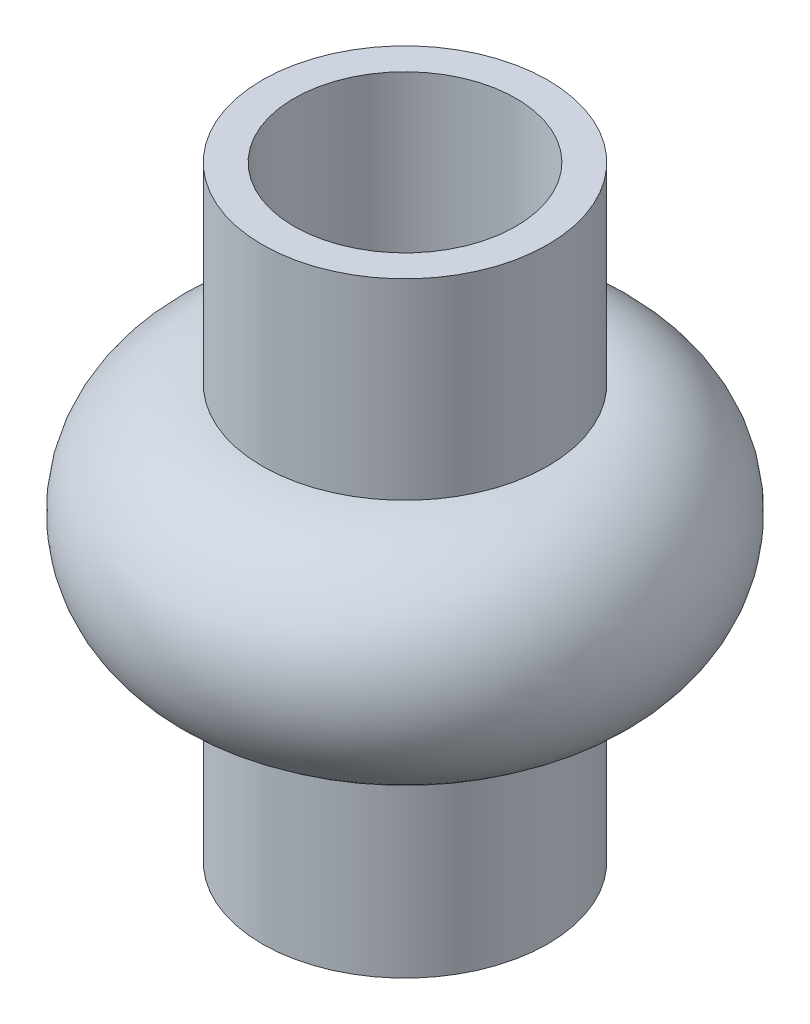
ISO-10303-21;
HEADER;
FILE_DESCRIPTION(('STEP AP214'),'2;1');
FILE_NAME('part.step','',(''),(''),'','','');
FILE_SCHEMA(('AUTOMOTIVE_DESIGN { 1 0 10303 214 1 1 1 1 }'));
ENDSEC;
DATA;
#1=APPLICATION_CONTEXT('core data for automotive mechanical design processes');
#2=APPLICATION_PROTOCOL_DEFINITION('international standard','automotive_design',2000,#1);
#3=PRODUCT_CONTEXT('',#1,'mechanical');
#4=PRODUCT('Part','Part','',(#3));
#5=PRODUCT_RELATED_PRODUCT_CATEGORY('part','',(#4));
#6=PRODUCT_DEFINITION_FORMATION('','',#4);
#7=PRODUCT_DEFINITION_CONTEXT('part definition',#1,'design');
#8=PRODUCT_DEFINITION('design','',#6,#7);
#9=PRODUCT_DEFINITION_SHAPE('','',#8);
#10=(LENGTH_UNIT() NAMED_UNIT(*) SI_UNIT(.MILLI.,.METRE.));
#11=(NAMED_UNIT(*) PLANE_ANGLE_UNIT() SI_UNIT($,.RADIAN.));
#12=(NAMED_UNIT(*) SI_UNIT($,.STERADIAN.) SOLID_ANGLE_UNIT());
#13=UNCERTAINTY_MEASURE_WITH_UNIT(LENGTH_MEASURE(1.E-05),#10,'distance_accuracy_value','');
#14=(GEOMETRIC_REPRESENTATION_CONTEXT(3) GLOBAL_UNCERTAINTY_ASSIGNED_CONTEXT((#13)) GLOBAL_UNIT_ASSIGNED_CONTEXT((#10,
#11,#12)) REPRESENTATION_CONTEXT('',''));
#15=CARTESIAN_POINT('',(0.,0.,0.));
#16=DIRECTION('',(0.,0.,1.));
#17=DIRECTION('',(1.,0.,0.));
#18=AXIS2_PLACEMENT_3D('',#15,#16,#17);
#19=CARTESIAN_POINT('',(-7.,7.,0.));
#20=CARTESIAN_POINT('',(-7.,5.32892910344493,0.));
#21=CARTESIAN_POINT('',(-12.6998049546355,5.9906861598264,0.));
#22=CARTESIAN_POINT('',(-14.713166347637,-0.0225987930732187,0.));
#23=CARTESIAN_POINT('',(-12.6998049546355,-5.90828507939861,0.));
#24=CARTESIAN_POINT('',(-7.,-5.46458272505829,0.));
#25=CARTESIAN_POINT('',(-7.,-7.,0.));
#26=B_SPLINE_CURVE_WITH_KNOTS('',3,(#19,#20,#21,#22,#23,#24,#25),.UNSPECIFIED.,.F.,.F.,(4,1,1,1,
4),(0.,0.225746398519351,0.5,0.774253601480648,1.),.UNSPECIFIED.);
#27=CARTESIAN_POINT('',(0.,18.4626539289852,0.));
#28=DIRECTION('',(0.,1.,0.));
#29=AXIS1_PLACEMENT('',#27,#28);
#30=SURFACE_OF_REVOLUTION('',#26,#29);
#31=CARTESIAN_POINT('',(0.,-7.,0.));
#32=DIRECTION('',(0.,1.,0.));
#33=DIRECTION('',(0.,0.,1.));
#34=AXIS2_PLACEMENT_3D('',#31,#32,#33);
#35=CIRCLE('',#34,7.);
#36=CARTESIAN_POINT('',(0.,-7.,7.));
#37=VERTEX_POINT('',#36);
#38=EDGE_CURVE('E81',#37,#37,#35,.T.);
#39=ORIENTED_EDGE('',*,*,#38,.F.);
#40=EDGE_LOOP('',(#39));
#41=FACE_BOUND('',#40,.T.);
#42=CARTESIAN_POINT('',(0.,7.,0.));
#43=DIRECTION('',(0.,1.,0.));
#44=DIRECTION('',(0.,0.,1.));
#45=AXIS2_PLACEMENT_3D('',#42,#43,#44);
#46=CIRCLE('',#45,7.);
#47=CARTESIAN_POINT('',(0.,7.,7.));
#48=VERTEX_POINT('',#47);
#49=EDGE_CURVE('E10',#48,#48,#46,.T.);
#50=ORIENTED_EDGE('',*,*,#49,.T.);
#51=EDGE_LOOP('',(#50));
#52=FACE_BOUND('',#51,.T.);
#53=ADVANCED_FACE('F45',(#41,#52),#30,.T.);
#54=CARTESIAN_POINT('',(0.,18.4626539289852,0.));
#55=DIRECTION('',(0.,1.,0.));
#56=DIRECTION('',(0.,0.,1.));
#57=AXIS2_PLACEMENT_3D('',#54,#55,#56);
#58=CYLINDRICAL_SURFACE('',#57,7.);
#59=ORIENTED_EDGE('',*,*,#49,.F.);
#60=EDGE_LOOP('',(#59));
#61=FACE_BOUND('',#60,.T.);
#62=CARTESIAN_POINT('',(0.,19.1,0.));
#63=DIRECTION('',(0.,1.,0.));
#64=DIRECTION('',(0.,0.,1.));
#65=AXIS2_PLACEMENT_3D('',#62,#63,#64);
#66=CIRCLE('',#65,7.);
#67=CARTESIAN_POINT('',(0.,19.1,7.));
#68=VERTEX_POINT('',#67);
#69=EDGE_CURVE('E53',#68,#68,#66,.T.);
#70=ORIENTED_EDGE('',*,*,#69,.T.);
#71=EDGE_LOOP('',(#70));
#72=FACE_BOUND('',#71,.T.);
#73=ADVANCED_FACE('F96',(#61,#72),#58,.F.);
#74=CARTESIAN_POINT('',(0.,19.1,0.));
#75=DIRECTION('',(0.,-1.,0.));
#76=DIRECTION('',(0.,0.,-1.));
#77=AXIS2_PLACEMENT_3D('',#74,#75,#76);
#78=PLANE('',#77);
#79=ORIENTED_EDGE('',*,*,#69,.F.);
#80=EDGE_LOOP('',(#79));
#81=FACE_BOUND('',#80,.T.);
#82=CARTESIAN_POINT('',(0.,19.1,0.));
#83=DIRECTION('',(0.,1.,0.));
#84=DIRECTION('',(0.,0.,1.));
#85=AXIS2_PLACEMENT_3D('',#82,#83,#84);
#86=CIRCLE('',#85,9.);
#87=CARTESIAN_POINT('',(0.,19.1,9.));
#88=VERTEX_POINT('',#87);
#89=EDGE_CURVE('E58',#88,#88,#86,.T.);
#90=ORIENTED_EDGE('',*,*,#89,.T.);
#91=EDGE_LOOP('',(#90));
#92=FACE_BOUND('',#91,.T.);
#93=ADVANCED_FACE('F100',(#81,#92),#78,.F.);
#94=CARTESIAN_POINT('',(0.,18.4626539289852,0.));
#95=DIRECTION('',(0.,1.,0.));
#96=DIRECTION('',(0.,0.,1.));
#97=AXIS2_PLACEMENT_3D('',#94,#95,#96);
#98=CYLINDRICAL_SURFACE('',#97,9.);
#99=CARTESIAN_POINT('',(0.,7.,0.));
#100=DIRECTION('',(0.,1.,0.));
#101=DIRECTION('',(0.,0.,1.));
#102=AXIS2_PLACEMENT_3D('',#99,#100,#101);
#103=CIRCLE('',#102,9.);
#104=CARTESIAN_POINT('',(0.,7.,9.));
#105=VERTEX_POINT('',#104);
#106=EDGE_CURVE('E63',#105,#105,#103,.T.);
#107=ORIENTED_EDGE('',*,*,#106,.T.);
#108=EDGE_LOOP('',(#107));
#109=FACE_BOUND('',#108,.T.);
#110=ORIENTED_EDGE('',*,*,#89,.F.);
#111=EDGE_LOOP('',(#110));
#112=FACE_BOUND('',#111,.T.);
#113=ADVANCED_FACE('F105',(#109,#112),#98,.T.);
#114=CARTESIAN_POINT('',(0.,0.,0.));
#115=DIRECTION('',(0.,1.,0.));
#116=DIRECTION('',(0.,0.,1.));
#117=AXIS2_PLACEMENT_3D('',#114,#115,#116);
#118=TOROIDAL_SURFACE('',#117,9.,7.);
#119=ORIENTED_EDGE('',*,*,#106,.F.);
#120=EDGE_LOOP('',(#119));
#121=FACE_BOUND('',#120,.T.);
#122=CARTESIAN_POINT('',(0.,-7.,0.));
#123=DIRECTION('',(0.,1.,0.));
#124=DIRECTION('',(0.,0.,1.));
#125=AXIS2_PLACEMENT_3D('',#122,#123,#124);
#126=CIRCLE('',#125,9.);
#127=CARTESIAN_POINT('',(0.,-7.,9.));
#128=VERTEX_POINT('',#127);
#129=EDGE_CURVE('E69',#128,#128,#126,.T.);
#130=ORIENTED_EDGE('',*,*,#129,.T.);
#131=EDGE_LOOP('',(#130));
#132=FACE_BOUND('',#131,.T.);
#133=ADVANCED_FACE('F111',(#121,#132),#118,.T.);
#134=CARTESIAN_POINT('',(0.,18.4626539289852,0.));
#135=DIRECTION('',(0.,1.,0.));
#136=DIRECTION('',(0.,0.,1.));
#137=AXIS2_PLACEMENT_3D('',#134,#135,#136);
#138=CYLINDRICAL_SURFACE('',#137,9.);
#139=ORIENTED_EDGE('',*,*,#129,.F.);
#140=EDGE_LOOP('',(#139));
#141=FACE_BOUND('',#140,.T.);
#142=CARTESIAN_POINT('',(0.,-19.1,0.));
#143=DIRECTION('',(0.,1.,0.));
#144=DIRECTION('',(0.,0.,1.));
#145=AXIS2_PLACEMENT_3D('',#142,#143,#144);
#146=CIRCLE('',#145,9.);
#147=CARTESIAN_POINT('',(0.,-19.1,9.));
#148=VERTEX_POINT('',#147);
#149=EDGE_CURVE('E73',#148,#148,#146,.T.);
#150=ORIENTED_EDGE('',*,*,#149,.T.);
#151=EDGE_LOOP('',(#150));
#152=FACE_BOUND('',#151,.T.);
#153=ADVANCED_FACE('F115',(#141,#152),#138,.T.);
#154=CARTESIAN_POINT('',(0.,-19.1,0.));
#155=DIRECTION('',(0.,-1.,0.));
#156=DIRECTION('',(0.,0.,-1.));
#157=AXIS2_PLACEMENT_3D('',#154,#155,#156);
#158=PLANE('',#157);
#159=CARTESIAN_POINT('',(0.,-19.1,0.));
#160=DIRECTION('',(0.,1.,0.));
#161=DIRECTION('',(0.,0.,1.));
#162=AXIS2_PLACEMENT_3D('',#159,#160,#161);
#163=CIRCLE('',#162,7.);
#164=CARTESIAN_POINT('',(0.,-19.1,7.));
#165=VERTEX_POINT('',#164);
#166=EDGE_CURVE('E77',#165,#165,#163,.T.);
#167=ORIENTED_EDGE('',*,*,#166,.T.);
#168=EDGE_LOOP('',(#167));
#169=FACE_BOUND('',#168,.T.);
#170=ORIENTED_EDGE('',*,*,#149,.F.);
#171=EDGE_LOOP('',(#170));
#172=FACE_BOUND('',#171,.T.);
#173=ADVANCED_FACE('F119',(#169,#172),#158,.T.);
#174=CARTESIAN_POINT('',(0.,18.4626539289852,0.));
#175=DIRECTION('',(0.,1.,0.));
#176=DIRECTION('',(0.,0.,1.));
#177=AXIS2_PLACEMENT_3D('',#174,#175,#176);
#178=CYLINDRICAL_SURFACE('',#177,7.);
#179=ORIENTED_EDGE('',*,*,#38,.T.);
#180=EDGE_LOOP('',(#179));
#181=FACE_BOUND('',#180,.T.);
#182=ORIENTED_EDGE('',*,*,#166,.F.);
#183=EDGE_LOOP('',(#182));
#184=FACE_BOUND('',#183,.T.);
#185=ADVANCED_FACE('F92',(#181,#184),#178,.F.);
#186=CLOSED_SHELL('',(#53,#73,#93,#113,#133,#153,#173,#185));
#187=MANIFOLD_SOLID_BREP('B2',#186);
#188=ADVANCED_BREP_SHAPE_REPRESENTATION('',(#18,#187),#14);
#189=SHAPE_DEFINITION_REPRESENTATION(#9,#188);
ENDSEC;
END-ISO-10303-21;
